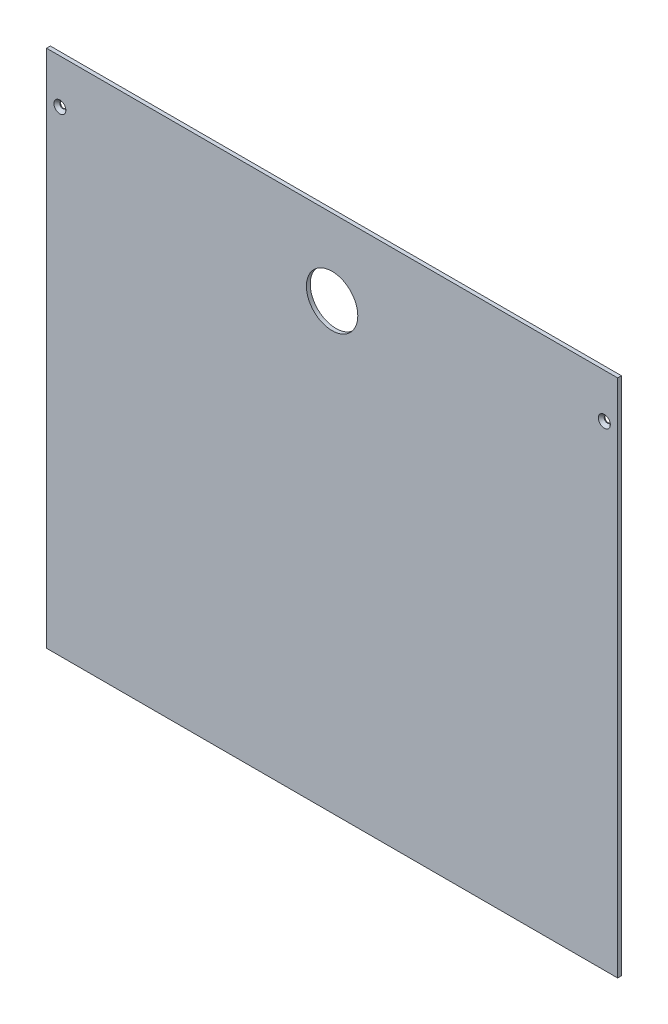
ISO-10303-21;
HEADER;
FILE_DESCRIPTION(('STEP AP214'),'2;1');
FILE_NAME('part.step','',(''),(''),'','','');
FILE_SCHEMA(('AUTOMOTIVE_DESIGN { 1 0 10303 214 1 1 1 1 }'));
ENDSEC;
DATA;
#1=APPLICATION_CONTEXT('core data for automotive mechanical design processes');
#2=APPLICATION_PROTOCOL_DEFINITION('international standard','automotive_design',2000,#1);
#3=PRODUCT_CONTEXT('',#1,'mechanical');
#4=PRODUCT('Part','Part','',(#3));
#5=PRODUCT_RELATED_PRODUCT_CATEGORY('part','',(#4));
#6=PRODUCT_DEFINITION_FORMATION('','',#4);
#7=PRODUCT_DEFINITION_CONTEXT('part definition',#1,'design');
#8=PRODUCT_DEFINITION('design','',#6,#7);
#9=PRODUCT_DEFINITION_SHAPE('','',#8);
#10=(LENGTH_UNIT() NAMED_UNIT(*) SI_UNIT(.MILLI.,.METRE.));
#11=(NAMED_UNIT(*) PLANE_ANGLE_UNIT() SI_UNIT($,.RADIAN.));
#12=(NAMED_UNIT(*) SI_UNIT($,.STERADIAN.) SOLID_ANGLE_UNIT());
#13=UNCERTAINTY_MEASURE_WITH_UNIT(LENGTH_MEASURE(1.E-05),#10,'distance_accuracy_value','');
#14=(GEOMETRIC_REPRESENTATION_CONTEXT(3) GLOBAL_UNCERTAINTY_ASSIGNED_CONTEXT((#13)) GLOBAL_UNIT_ASSIGNED_CONTEXT((#10,
#11,#12)) REPRESENTATION_CONTEXT('',''));
#15=CARTESIAN_POINT('',(0.,0.,0.));
#16=DIRECTION('',(0.,0.,1.));
#17=DIRECTION('',(1.,0.,0.));
#18=AXIS2_PLACEMENT_3D('',#15,#16,#17);
#19=CARTESIAN_POINT('',(0.,0.,-2.));
#20=DIRECTION('',(1.,0.,0.));
#21=DIRECTION('',(0.,1.,0.));
#22=AXIS2_PLACEMENT_3D('',#19,#20,#21);
#23=PLANE('',#22);
#24=DIRECTION('',(0.,1.,0.));
#25=VECTOR('',#24,1.);
#26=CARTESIAN_POINT('',(0.,0.,0.));
#27=LINE('',#26,#25);
#28=CARTESIAN_POINT('',(0.,0.,0.));
#29=VERTEX_POINT('',#28);
#30=CARTESIAN_POINT('',(0.,273.,0.));
#31=VERTEX_POINT('',#30);
#32=EDGE_CURVE('E104',#29,#31,#27,.T.);
#33=ORIENTED_EDGE('',*,*,#32,.F.);
#34=DIRECTION('',(0.,0.,1.));
#35=VECTOR('',#34,1.);
#36=CARTESIAN_POINT('',(0.,0.,-2.));
#37=LINE('',#36,#35);
#38=CARTESIAN_POINT('',(0.,0.,-2.));
#39=VERTEX_POINT('',#38);
#40=EDGE_CURVE('E11',#39,#29,#37,.T.);
#41=ORIENTED_EDGE('',*,*,#40,.F.);
#42=DIRECTION('',(0.,1.,0.));
#43=VECTOR('',#42,1.);
#44=CARTESIAN_POINT('',(0.,0.,-2.));
#45=LINE('',#44,#43);
#46=CARTESIAN_POINT('',(0.,273.,-2.));
#47=VERTEX_POINT('',#46);
#48=EDGE_CURVE('E97',#39,#47,#45,.T.);
#49=ORIENTED_EDGE('',*,*,#48,.T.);
#50=DIRECTION('',(0.,0.,1.));
#51=VECTOR('',#50,1.);
#52=CARTESIAN_POINT('',(0.,273.,-2.));
#53=LINE('',#52,#51);
#54=EDGE_CURVE('E42',#47,#31,#53,.T.);
#55=ORIENTED_EDGE('',*,*,#54,.T.);
#56=EDGE_LOOP('',(#33,#41,#49,#55));
#57=FACE_BOUND('',#56,.T.);
#58=ADVANCED_FACE('F39',(#57),#23,.T.);
#59=CARTESIAN_POINT('',(0.,0.,-2.));
#60=DIRECTION('',(0.,-1.,0.));
#61=DIRECTION('',(1.,0.,0.));
#62=AXIS2_PLACEMENT_3D('',#59,#60,#61);
#63=PLANE('',#62);
#64=DIRECTION('',(1.,0.,0.));
#65=VECTOR('',#64,1.);
#66=CARTESIAN_POINT('',(0.,0.,0.));
#67=LINE('',#66,#65);
#68=CARTESIAN_POINT('',(-300.,0.,0.));
#69=VERTEX_POINT('',#68);
#70=EDGE_CURVE('E99',#69,#29,#67,.T.);
#71=ORIENTED_EDGE('',*,*,#70,.F.);
#72=DIRECTION('',(0.,0.,1.));
#73=VECTOR('',#72,1.);
#74=CARTESIAN_POINT('',(-300.,0.,-2.));
#75=LINE('',#74,#73);
#76=CARTESIAN_POINT('',(-300.,0.,-2.));
#77=VERTEX_POINT('',#76);
#78=EDGE_CURVE('E48',#77,#69,#75,.T.);
#79=ORIENTED_EDGE('',*,*,#78,.F.);
#80=DIRECTION('',(1.,0.,0.));
#81=VECTOR('',#80,1.);
#82=CARTESIAN_POINT('',(0.,0.,-2.));
#83=LINE('',#82,#81);
#84=EDGE_CURVE('E94',#77,#39,#83,.T.);
#85=ORIENTED_EDGE('',*,*,#84,.T.);
#86=ORIENTED_EDGE('',*,*,#40,.T.);
#87=EDGE_LOOP('',(#71,#79,#85,#86));
#88=FACE_BOUND('',#87,.T.);
#89=ADVANCED_FACE('F115',(#88),#63,.T.);
#90=CARTESIAN_POINT('',(-300.,0.,-2.));
#91=DIRECTION('',(-1.,0.,0.));
#92=DIRECTION('',(0.,0.,1.));
#93=AXIS2_PLACEMENT_3D('',#90,#91,#92);
#94=PLANE('',#93);
#95=DIRECTION('',(0.,-1.,0.));
#96=VECTOR('',#95,1.);
#97=CARTESIAN_POINT('',(-300.,0.,0.));
#98=LINE('',#97,#96);
#99=CARTESIAN_POINT('',(-300.,273.,0.));
#100=VERTEX_POINT('',#99);
#101=EDGE_CURVE('E89',#100,#69,#98,.T.);
#102=ORIENTED_EDGE('',*,*,#101,.F.);
#103=DIRECTION('',(0.,0.,1.));
#104=VECTOR('',#103,1.);
#105=CARTESIAN_POINT('',(-300.,273.,-2.));
#106=LINE('',#105,#104);
#107=CARTESIAN_POINT('',(-300.,273.,-2.));
#108=VERTEX_POINT('',#107);
#109=EDGE_CURVE('E84',#108,#100,#106,.T.);
#110=ORIENTED_EDGE('',*,*,#109,.F.);
#111=DIRECTION('',(0.,-1.,0.));
#112=VECTOR('',#111,1.);
#113=CARTESIAN_POINT('',(-300.,0.,-2.));
#114=LINE('',#113,#112);
#115=EDGE_CURVE('E87',#108,#77,#114,.T.);
#116=ORIENTED_EDGE('',*,*,#115,.T.);
#117=ORIENTED_EDGE('',*,*,#78,.T.);
#118=EDGE_LOOP('',(#102,#110,#116,#117));
#119=FACE_BOUND('',#118,.T.);
#120=ADVANCED_FACE('F86',(#119),#94,.T.);
#121=CARTESIAN_POINT('',(0.,273.,-2.));
#122=DIRECTION('',(0.,1.,0.));
#123=DIRECTION('',(-1.,0.,0.));
#124=AXIS2_PLACEMENT_3D('',#121,#122,#123);
#125=PLANE('',#124);
#126=DIRECTION('',(-1.,0.,0.));
#127=VECTOR('',#126,1.);
#128=CARTESIAN_POINT('',(0.,273.,0.));
#129=LINE('',#128,#127);
#130=EDGE_CURVE('E107',#31,#100,#129,.T.);
#131=ORIENTED_EDGE('',*,*,#130,.F.);
#132=ORIENTED_EDGE('',*,*,#54,.F.);
#133=DIRECTION('',(-1.,0.,0.));
#134=VECTOR('',#133,1.);
#135=CARTESIAN_POINT('',(0.,273.,-2.));
#136=LINE('',#135,#134);
#137=EDGE_CURVE('E93',#47,#108,#136,.T.);
#138=ORIENTED_EDGE('',*,*,#137,.T.);
#139=ORIENTED_EDGE('',*,*,#109,.T.);
#140=EDGE_LOOP('',(#131,#132,#138,#139));
#141=FACE_BOUND('',#140,.T.);
#142=ADVANCED_FACE('F96',(#141),#125,.T.);
#143=CARTESIAN_POINT('',(0.,0.,-2.));
#144=DIRECTION('',(0.,0.,1.));
#145=DIRECTION('',(1.,0.,0.));
#146=AXIS2_PLACEMENT_3D('',#143,#144,#145);
#147=PLANE('',#146);
#148=CARTESIAN_POINT('',(-150.,233.,-2.));
#149=DIRECTION('',(0.,0.,1.));
#150=DIRECTION('',(1.,0.,0.));
#151=AXIS2_PLACEMENT_3D('',#148,#149,#150);
#152=CIRCLE('',#151,13.5);
#153=CARTESIAN_POINT('',(-136.5,233.,-2.));
#154=VERTEX_POINT('',#153);
#155=EDGE_CURVE('E160',#154,#154,#152,.T.);
#156=ORIENTED_EDGE('',*,*,#155,.T.);
#157=EDGE_LOOP('',(#156));
#158=FACE_BOUND('',#157,.T.);
#159=CARTESIAN_POINT('',(-7.00000000000001,249.78,-2.));
#160=DIRECTION('',(0.,0.,1.));
#161=DIRECTION('',(1.,0.,0.));
#162=AXIS2_PLACEMENT_3D('',#159,#160,#161);
#163=CIRCLE('',#162,1.6);
#164=CARTESIAN_POINT('',(-5.40000000000001,249.78,-2.));
#165=VERTEX_POINT('',#164);
#166=EDGE_CURVE('E173',#165,#165,#163,.T.);
#167=ORIENTED_EDGE('',*,*,#166,.T.);
#168=EDGE_LOOP('',(#167));
#169=FACE_BOUND('',#168,.T.);
#170=CARTESIAN_POINT('',(-293.,249.78,-2.));
#171=DIRECTION('',(0.,0.,1.));
#172=DIRECTION('',(1.,0.,0.));
#173=AXIS2_PLACEMENT_3D('',#170,#171,#172);
#174=CIRCLE('',#173,1.59999999999999);
#175=CARTESIAN_POINT('',(-291.4,249.78,-2.));
#176=VERTEX_POINT('',#175);
#177=EDGE_CURVE('E108',#176,#176,#174,.T.);
#178=ORIENTED_EDGE('',*,*,#177,.T.);
#179=EDGE_LOOP('',(#178));
#180=FACE_BOUND('',#179,.T.);
#181=ORIENTED_EDGE('',*,*,#48,.F.);
#182=ORIENTED_EDGE('',*,*,#84,.F.);
#183=ORIENTED_EDGE('',*,*,#115,.F.);
#184=ORIENTED_EDGE('',*,*,#137,.F.);
#185=EDGE_LOOP('',(#181,#182,#183,#184));
#186=FACE_BOUND('',#185,.T.);
#187=ADVANCED_FACE('F92',(#158,#169,#180,#186),#147,.F.);
#188=CARTESIAN_POINT('',(0.,0.,0.));
#189=DIRECTION('',(0.,0.,1.));
#190=DIRECTION('',(1.,0.,0.));
#191=AXIS2_PLACEMENT_3D('',#188,#189,#190);
#192=PLANE('',#191);
#193=CARTESIAN_POINT('',(-150.,233.,0.));
#194=DIRECTION('',(0.,0.,1.));
#195=DIRECTION('',(1.,0.,0.));
#196=AXIS2_PLACEMENT_3D('',#193,#194,#195);
#197=CIRCLE('',#196,13.5);
#198=CARTESIAN_POINT('',(-136.5,233.,0.));
#199=VERTEX_POINT('',#198);
#200=EDGE_CURVE('E163',#199,#199,#197,.T.);
#201=ORIENTED_EDGE('',*,*,#200,.F.);
#202=EDGE_LOOP('',(#201));
#203=FACE_BOUND('',#202,.T.);
#204=CARTESIAN_POINT('',(-7.00000000000001,249.78,0.));
#205=DIRECTION('',(0.,0.,1.));
#206=DIRECTION('',(1.,0.,0.));
#207=AXIS2_PLACEMENT_3D('',#204,#205,#206);
#208=CIRCLE('',#207,3.15);
#209=CARTESIAN_POINT('',(-3.85000000000001,249.78,0.));
#210=VERTEX_POINT('',#209);
#211=EDGE_CURVE('E165',#210,#210,#208,.T.);
#212=ORIENTED_EDGE('',*,*,#211,.F.);
#213=EDGE_LOOP('',(#212));
#214=FACE_BOUND('',#213,.T.);
#215=CARTESIAN_POINT('',(-293.,249.78,0.));
#216=DIRECTION('',(0.,0.,1.));
#217=DIRECTION('',(1.,0.,0.));
#218=AXIS2_PLACEMENT_3D('',#215,#216,#217);
#219=CIRCLE('',#218,3.14999999999999);
#220=CARTESIAN_POINT('',(-289.85,249.78,0.));
#221=VERTEX_POINT('',#220);
#222=EDGE_CURVE('E176',#221,#221,#219,.T.);
#223=ORIENTED_EDGE('',*,*,#222,.F.);
#224=EDGE_LOOP('',(#223));
#225=FACE_BOUND('',#224,.T.);
#226=ORIENTED_EDGE('',*,*,#32,.T.);
#227=ORIENTED_EDGE('',*,*,#130,.T.);
#228=ORIENTED_EDGE('',*,*,#101,.T.);
#229=ORIENTED_EDGE('',*,*,#70,.T.);
#230=EDGE_LOOP('',(#226,#227,#228,#229));
#231=FACE_BOUND('',#230,.T.);
#232=ADVANCED_FACE('F114',(#203,#214,#225,#231),#192,.T.);
#233=CARTESIAN_POINT('',(-293.,249.78,0.));
#234=DIRECTION('',(0.,0.,1.));
#235=DIRECTION('',(1.,0.,0.));
#236=AXIS2_PLACEMENT_3D('',#233,#234,#235);
#237=CYLINDRICAL_SURFACE('',#236,1.59999999999999);
#238=ORIENTED_EDGE('',*,*,#177,.F.);
#239=EDGE_LOOP('',(#238));
#240=FACE_BOUND('',#239,.T.);
#241=CARTESIAN_POINT('',(-293.,249.78,-1.55));
#242=DIRECTION('',(0.,0.,1.));
#243=DIRECTION('',(1.,0.,0.));
#244=AXIS2_PLACEMENT_3D('',#241,#242,#243);
#245=CIRCLE('',#244,1.59999999999999);
#246=CARTESIAN_POINT('',(-291.4,249.78,-1.55));
#247=VERTEX_POINT('',#246);
#248=EDGE_CURVE('E179',#247,#247,#245,.T.);
#249=ORIENTED_EDGE('',*,*,#248,.T.);
#250=EDGE_LOOP('',(#249));
#251=FACE_BOUND('',#250,.T.);
#252=ADVANCED_FACE('F133',(#240,#251),#237,.F.);
#253=CARTESIAN_POINT('',(-293.,249.78,0.));
#254=DIRECTION('',(0.,0.,1.));
#255=DIRECTION('',(1.,0.,0.));
#256=AXIS2_PLACEMENT_3D('',#253,#254,#255);
#257=CONICAL_SURFACE('',#256,3.14999999999999,0.785398163397447);
#258=ORIENTED_EDGE('',*,*,#248,.F.);
#259=EDGE_LOOP('',(#258));
#260=FACE_BOUND('',#259,.T.);
#261=ORIENTED_EDGE('',*,*,#222,.T.);
#262=EDGE_LOOP('',(#261));
#263=FACE_BOUND('',#262,.T.);
#264=ADVANCED_FACE('F140',(#260,#263),#257,.F.);
#265=CARTESIAN_POINT('',(-7.00000000000001,249.78,0.));
#266=DIRECTION('',(0.,0.,1.));
#267=DIRECTION('',(1.,0.,0.));
#268=AXIS2_PLACEMENT_3D('',#265,#266,#267);
#269=CYLINDRICAL_SURFACE('',#268,1.6);
#270=ORIENTED_EDGE('',*,*,#166,.F.);
#271=EDGE_LOOP('',(#270));
#272=FACE_BOUND('',#271,.T.);
#273=CARTESIAN_POINT('',(-7.00000000000001,249.78,-1.55));
#274=DIRECTION('',(0.,0.,1.));
#275=DIRECTION('',(1.,0.,0.));
#276=AXIS2_PLACEMENT_3D('',#273,#274,#275);
#277=CIRCLE('',#276,1.6);
#278=CARTESIAN_POINT('',(-5.40000000000001,249.78,-1.55));
#279=VERTEX_POINT('',#278);
#280=EDGE_CURVE('E170',#279,#279,#277,.T.);
#281=ORIENTED_EDGE('',*,*,#280,.T.);
#282=EDGE_LOOP('',(#281));
#283=FACE_BOUND('',#282,.T.);
#284=ADVANCED_FACE('F144',(#272,#283),#269,.F.);
#285=CARTESIAN_POINT('',(-7.00000000000001,249.78,0.));
#286=DIRECTION('',(0.,0.,1.));
#287=DIRECTION('',(1.,0.,0.));
#288=AXIS2_PLACEMENT_3D('',#285,#286,#287);
#289=CONICAL_SURFACE('',#288,3.15,0.785398163397449);
#290=ORIENTED_EDGE('',*,*,#280,.F.);
#291=EDGE_LOOP('',(#290));
#292=FACE_BOUND('',#291,.T.);
#293=ORIENTED_EDGE('',*,*,#211,.T.);
#294=EDGE_LOOP('',(#293));
#295=FACE_BOUND('',#294,.T.);
#296=ADVANCED_FACE('F148',(#292,#295),#289,.F.);
#297=CARTESIAN_POINT('',(-150.,233.,0.));
#298=DIRECTION('',(0.,0.,1.));
#299=DIRECTION('',(1.,0.,0.));
#300=AXIS2_PLACEMENT_3D('',#297,#298,#299);
#301=CYLINDRICAL_SURFACE('',#300,13.5);
#302=ORIENTED_EDGE('',*,*,#155,.F.);
#303=EDGE_LOOP('',(#302));
#304=FACE_BOUND('',#303,.T.);
#305=ORIENTED_EDGE('',*,*,#200,.T.);
#306=EDGE_LOOP('',(#305));
#307=FACE_BOUND('',#306,.T.);
#308=ADVANCED_FACE('F152',(#304,#307),#301,.F.);
#309=CLOSED_SHELL('',(#58,#89,#120,#142,#187,#232,#252,#264,#284,#296,#308));
#310=MANIFOLD_SOLID_BREP('B2',#309);
#311=ADVANCED_BREP_SHAPE_REPRESENTATION('',(#18,#310),#14);
#312=SHAPE_DEFINITION_REPRESENTATION(#9,#311);
ENDSEC;
END-ISO-10303-21;
